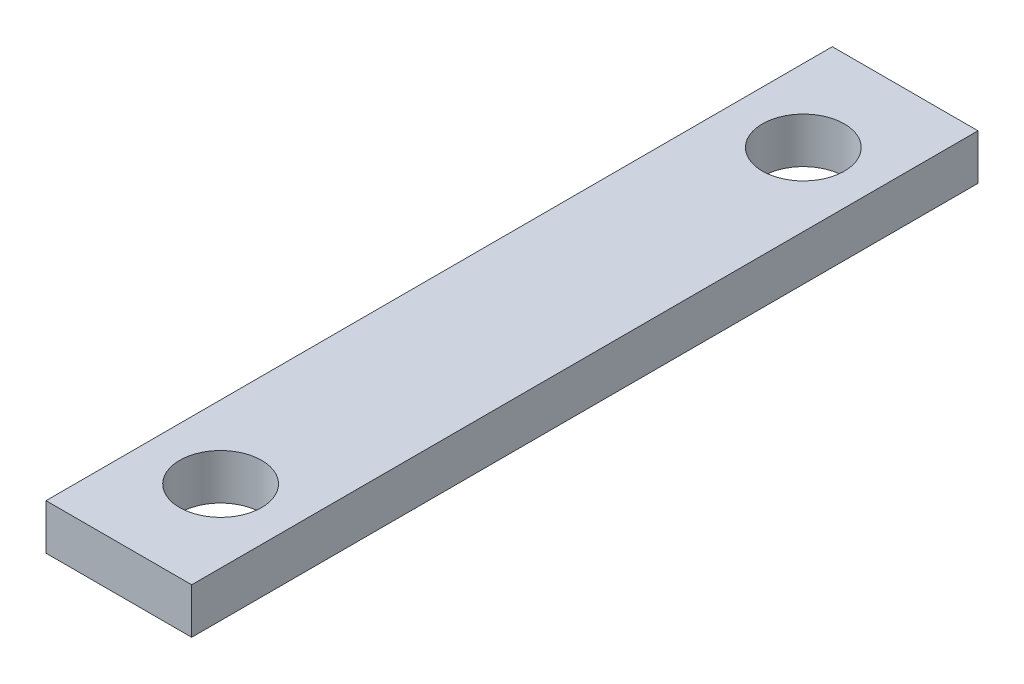
ISO-10303-21;
HEADER;
FILE_DESCRIPTION(('STEP AP214'),'2;1');
FILE_NAME('part.step','',(''),(''),'','','');
FILE_SCHEMA(('AUTOMOTIVE_DESIGN { 1 0 10303 214 1 1 1 1 }'));
ENDSEC;
DATA;
#1=APPLICATION_CONTEXT('core data for automotive mechanical design processes');
#2=APPLICATION_PROTOCOL_DEFINITION('international standard','automotive_design',2000,#1);
#3=PRODUCT_CONTEXT('',#1,'mechanical');
#4=PRODUCT('Part','Part','',(#3));
#5=PRODUCT_RELATED_PRODUCT_CATEGORY('part','',(#4));
#6=PRODUCT_DEFINITION_FORMATION('','',#4);
#7=PRODUCT_DEFINITION_CONTEXT('part definition',#1,'design');
#8=PRODUCT_DEFINITION('design','',#6,#7);
#9=PRODUCT_DEFINITION_SHAPE('','',#8);
#10=(LENGTH_UNIT() NAMED_UNIT(*) SI_UNIT(.MILLI.,.METRE.));
#11=(NAMED_UNIT(*) PLANE_ANGLE_UNIT() SI_UNIT($,.RADIAN.));
#12=(NAMED_UNIT(*) SI_UNIT($,.STERADIAN.) SOLID_ANGLE_UNIT());
#13=UNCERTAINTY_MEASURE_WITH_UNIT(LENGTH_MEASURE(1.E-05),#10,'distance_accuracy_value','');
#14=(GEOMETRIC_REPRESENTATION_CONTEXT(3) GLOBAL_UNCERTAINTY_ASSIGNED_CONTEXT((#13)) GLOBAL_UNIT_ASSIGNED_CONTEXT((#10,
#11,#12)) REPRESENTATION_CONTEXT('',''));
#15=CARTESIAN_POINT('',(0.,0.,0.));
#16=DIRECTION('',(0.,0.,1.));
#17=DIRECTION('',(1.,0.,0.));
#18=AXIS2_PLACEMENT_3D('',#15,#16,#17);
#19=CARTESIAN_POINT('',(0.,-26.5,0.));
#20=DIRECTION('',(0.,-1.,0.));
#21=DIRECTION('',(0.,0.,-1.));
#22=AXIS2_PLACEMENT_3D('',#19,#20,#21);
#23=PLANE('',#22);
#24=CARTESIAN_POINT('',(-43.37,-26.5,16.));
#25=DIRECTION('',(0.,-1.,0.));
#26=DIRECTION('',(0.,0.,-1.));
#27=AXIS2_PLACEMENT_3D('',#24,#25,#26);
#28=CIRCLE('',#27,2.25);
#29=CARTESIAN_POINT('',(-43.37,-26.5,13.75));
#30=VERTEX_POINT('',#29);
#31=EDGE_CURVE('E106',#30,#30,#28,.T.);
#32=ORIENTED_EDGE('',*,*,#31,.F.);
#33=EDGE_LOOP('',(#32));
#34=FACE_BOUND('',#33,.T.);
#35=DIRECTION('',(0.,0.,-1.));
#36=VECTOR('',#35,1.);
#37=CARTESIAN_POINT('',(-47.37,-26.5,-21.59));
#38=LINE('',#37,#36);
#39=CARTESIAN_POINT('',(-47.37,-26.5,21.59));
#40=VERTEX_POINT('',#39);
#41=CARTESIAN_POINT('',(-47.37,-26.5,-21.59));
#42=VERTEX_POINT('',#41);
#43=EDGE_CURVE('E93',#40,#42,#38,.T.);
#44=ORIENTED_EDGE('',*,*,#43,.T.);
#45=DIRECTION('',(1.,0.,0.));
#46=VECTOR('',#45,1.);
#47=CARTESIAN_POINT('',(-39.37,-26.5,-21.59));
#48=LINE('',#47,#46);
#49=CARTESIAN_POINT('',(-39.37,-26.5,-21.59));
#50=VERTEX_POINT('',#49);
#51=EDGE_CURVE('E88',#42,#50,#48,.T.);
#52=ORIENTED_EDGE('',*,*,#51,.T.);
#53=DIRECTION('',(0.,0.,1.));
#54=VECTOR('',#53,1.);
#55=CARTESIAN_POINT('',(-39.37,-26.5,-21.59));
#56=LINE('',#55,#54);
#57=CARTESIAN_POINT('',(-39.37,-26.5,21.59));
#58=VERTEX_POINT('',#57);
#59=EDGE_CURVE('E90',#50,#58,#56,.T.);
#60=ORIENTED_EDGE('',*,*,#59,.T.);
#61=DIRECTION('',(-1.,0.,0.));
#62=VECTOR('',#61,1.);
#63=CARTESIAN_POINT('',(-39.37,-26.5,21.59));
#64=LINE('',#63,#62);
#65=EDGE_CURVE('E57',#58,#40,#64,.T.);
#66=ORIENTED_EDGE('',*,*,#65,.T.);
#67=EDGE_LOOP('',(#44,#52,#60,#66));
#68=FACE_BOUND('',#67,.T.);
#69=CARTESIAN_POINT('',(-43.37,-26.5,-16.));
#70=DIRECTION('',(0.,-1.,0.));
#71=DIRECTION('',(0.,0.,-1.));
#72=AXIS2_PLACEMENT_3D('',#69,#70,#71);
#73=CIRCLE('',#72,2.25);
#74=CARTESIAN_POINT('',(-43.37,-26.5,-18.25));
#75=VERTEX_POINT('',#74);
#76=EDGE_CURVE('E121',#75,#75,#73,.T.);
#77=ORIENTED_EDGE('',*,*,#76,.F.);
#78=EDGE_LOOP('',(#77));
#79=FACE_BOUND('',#78,.T.);
#80=ADVANCED_FACE('F39',(#34,#68,#79),#23,.T.);
#81=CARTESIAN_POINT('',(0.,-24.,0.));
#82=DIRECTION('',(0.,-1.,0.));
#83=DIRECTION('',(0.,0.,-1.));
#84=AXIS2_PLACEMENT_3D('',#81,#82,#83);
#85=PLANE('',#84);
#86=DIRECTION('',(0.,0.,-1.));
#87=VECTOR('',#86,1.);
#88=CARTESIAN_POINT('',(-47.37,-24.,-21.59));
#89=LINE('',#88,#87);
#90=CARTESIAN_POINT('',(-47.37,-24.,21.59));
#91=VERTEX_POINT('',#90);
#92=CARTESIAN_POINT('',(-47.37,-24.,-21.59));
#93=VERTEX_POINT('',#92);
#94=EDGE_CURVE('E103',#91,#93,#89,.T.);
#95=ORIENTED_EDGE('',*,*,#94,.F.);
#96=DIRECTION('',(-1.,0.,0.));
#97=VECTOR('',#96,1.);
#98=CARTESIAN_POINT('',(-39.37,-24.,21.59));
#99=LINE('',#98,#97);
#100=CARTESIAN_POINT('',(-39.37,-24.,21.59));
#101=VERTEX_POINT('',#100);
#102=EDGE_CURVE('E76',#101,#91,#99,.T.);
#103=ORIENTED_EDGE('',*,*,#102,.F.);
#104=DIRECTION('',(0.,0.,1.));
#105=VECTOR('',#104,1.);
#106=CARTESIAN_POINT('',(-39.37,-24.,-21.59));
#107=LINE('',#106,#105);
#108=CARTESIAN_POINT('',(-39.37,-24.,-21.59));
#109=VERTEX_POINT('',#108);
#110=EDGE_CURVE('E71',#109,#101,#107,.T.);
#111=ORIENTED_EDGE('',*,*,#110,.F.);
#112=DIRECTION('',(1.,0.,0.));
#113=VECTOR('',#112,1.);
#114=CARTESIAN_POINT('',(-39.37,-24.,-21.59));
#115=LINE('',#114,#113);
#116=EDGE_CURVE('E92',#93,#109,#115,.T.);
#117=ORIENTED_EDGE('',*,*,#116,.F.);
#118=EDGE_LOOP('',(#95,#103,#111,#117));
#119=FACE_BOUND('',#118,.T.);
#120=CARTESIAN_POINT('',(-43.37,-24.,16.));
#121=DIRECTION('',(0.,-1.,0.));
#122=DIRECTION('',(0.,0.,-1.));
#123=AXIS2_PLACEMENT_3D('',#120,#121,#122);
#124=CIRCLE('',#123,2.25);
#125=CARTESIAN_POINT('',(-43.37,-24.,13.75));
#126=VERTEX_POINT('',#125);
#127=EDGE_CURVE('E119',#126,#126,#124,.T.);
#128=ORIENTED_EDGE('',*,*,#127,.T.);
#129=EDGE_LOOP('',(#128));
#130=FACE_BOUND('',#129,.T.);
#131=CARTESIAN_POINT('',(-43.37,-24.,-16.));
#132=DIRECTION('',(0.,-1.,0.));
#133=DIRECTION('',(0.,0.,-1.));
#134=AXIS2_PLACEMENT_3D('',#131,#132,#133);
#135=CIRCLE('',#134,2.25);
#136=CARTESIAN_POINT('',(-43.37,-24.,-18.25));
#137=VERTEX_POINT('',#136);
#138=EDGE_CURVE('E122',#137,#137,#135,.T.);
#139=ORIENTED_EDGE('',*,*,#138,.T.);
#140=EDGE_LOOP('',(#139));
#141=FACE_BOUND('',#140,.T.);
#142=ADVANCED_FACE('F111',(#119,#130,#141),#85,.F.);
#143=CARTESIAN_POINT('',(-47.37,-26.5,-21.59));
#144=DIRECTION('',(1.,0.,0.));
#145=DIRECTION('',(0.,0.,-1.));
#146=AXIS2_PLACEMENT_3D('',#143,#144,#145);
#147=PLANE('',#146);
#148=ORIENTED_EDGE('',*,*,#94,.T.);
#149=DIRECTION('',(0.,1.,0.));
#150=VECTOR('',#149,1.);
#151=CARTESIAN_POINT('',(-47.37,-26.5,-21.59));
#152=LINE('',#151,#150);
#153=EDGE_CURVE('E11',#42,#93,#152,.T.);
#154=ORIENTED_EDGE('',*,*,#153,.F.);
#155=ORIENTED_EDGE('',*,*,#43,.F.);
#156=DIRECTION('',(0.,1.,0.));
#157=VECTOR('',#156,1.);
#158=CARTESIAN_POINT('',(-47.37,-26.5,21.59));
#159=LINE('',#158,#157);
#160=EDGE_CURVE('E97',#40,#91,#159,.T.);
#161=ORIENTED_EDGE('',*,*,#160,.T.);
#162=EDGE_LOOP('',(#148,#154,#155,#161));
#163=FACE_BOUND('',#162,.T.);
#164=ADVANCED_FACE('F41',(#163),#147,.F.);
#165=CARTESIAN_POINT('',(-39.37,-26.5,-21.59));
#166=DIRECTION('',(0.,0.,1.));
#167=DIRECTION('',(0.,-1.,0.));
#168=AXIS2_PLACEMENT_3D('',#165,#166,#167);
#169=PLANE('',#168);
#170=ORIENTED_EDGE('',*,*,#116,.T.);
#171=DIRECTION('',(0.,1.,0.));
#172=VECTOR('',#171,1.);
#173=CARTESIAN_POINT('',(-39.37,-26.5,-21.59));
#174=LINE('',#173,#172);
#175=EDGE_CURVE('E48',#50,#109,#174,.T.);
#176=ORIENTED_EDGE('',*,*,#175,.F.);
#177=ORIENTED_EDGE('',*,*,#51,.F.);
#178=ORIENTED_EDGE('',*,*,#153,.T.);
#179=EDGE_LOOP('',(#170,#176,#177,#178));
#180=FACE_BOUND('',#179,.T.);
#181=ADVANCED_FACE('F94',(#180),#169,.F.);
#182=CARTESIAN_POINT('',(-39.37,-26.5,-21.59));
#183=DIRECTION('',(-1.,0.,0.));
#184=DIRECTION('',(0.,0.,1.));
#185=AXIS2_PLACEMENT_3D('',#182,#183,#184);
#186=PLANE('',#185);
#187=ORIENTED_EDGE('',*,*,#110,.T.);
#188=DIRECTION('',(0.,1.,0.));
#189=VECTOR('',#188,1.);
#190=CARTESIAN_POINT('',(-39.37,-26.5,21.59));
#191=LINE('',#190,#189);
#192=EDGE_CURVE('E96',#58,#101,#191,.T.);
#193=ORIENTED_EDGE('',*,*,#192,.F.);
#194=ORIENTED_EDGE('',*,*,#59,.F.);
#195=ORIENTED_EDGE('',*,*,#175,.T.);
#196=EDGE_LOOP('',(#187,#193,#194,#195));
#197=FACE_BOUND('',#196,.T.);
#198=ADVANCED_FACE('F100',(#197),#186,.F.);
#199=CARTESIAN_POINT('',(-39.37,-26.5,21.59));
#200=DIRECTION('',(0.,0.,-1.));
#201=DIRECTION('',(0.,1.,0.));
#202=AXIS2_PLACEMENT_3D('',#199,#200,#201);
#203=PLANE('',#202);
#204=ORIENTED_EDGE('',*,*,#102,.T.);
#205=ORIENTED_EDGE('',*,*,#160,.F.);
#206=ORIENTED_EDGE('',*,*,#65,.F.);
#207=ORIENTED_EDGE('',*,*,#192,.T.);
#208=EDGE_LOOP('',(#204,#205,#206,#207));
#209=FACE_BOUND('',#208,.T.);
#210=ADVANCED_FACE('F112',(#209),#203,.F.);
#211=CARTESIAN_POINT('',(-43.37,-26.5,16.));
#212=DIRECTION('',(0.,1.,0.));
#213=DIRECTION('',(0.,0.,1.));
#214=AXIS2_PLACEMENT_3D('',#211,#212,#213);
#215=CYLINDRICAL_SURFACE('',#214,2.25);
#216=ORIENTED_EDGE('',*,*,#31,.T.);
#217=EDGE_LOOP('',(#216));
#218=FACE_BOUND('',#217,.T.);
#219=ORIENTED_EDGE('',*,*,#127,.F.);
#220=EDGE_LOOP('',(#219));
#221=FACE_BOUND('',#220,.T.);
#222=ADVANCED_FACE('F143',(#218,#221),#215,.F.);
#223=CARTESIAN_POINT('',(-43.37,-26.5,-16.));
#224=DIRECTION('',(0.,1.,0.));
#225=DIRECTION('',(0.,0.,1.));
#226=AXIS2_PLACEMENT_3D('',#223,#224,#225);
#227=CYLINDRICAL_SURFACE('',#226,2.25);
#228=ORIENTED_EDGE('',*,*,#76,.T.);
#229=EDGE_LOOP('',(#228));
#230=FACE_BOUND('',#229,.T.);
#231=ORIENTED_EDGE('',*,*,#138,.F.);
#232=EDGE_LOOP('',(#231));
#233=FACE_BOUND('',#232,.T.);
#234=ADVANCED_FACE('F128',(#230,#233),#227,.F.);
#235=CLOSED_SHELL('',(#80,#142,#164,#181,#198,#210,#222,#234));
#236=MANIFOLD_SOLID_BREP('B2',#235);
#237=ADVANCED_BREP_SHAPE_REPRESENTATION('',(#18,#236),#14);
#238=SHAPE_DEFINITION_REPRESENTATION(#9,#237);
ENDSEC;
END-ISO-10303-21;
